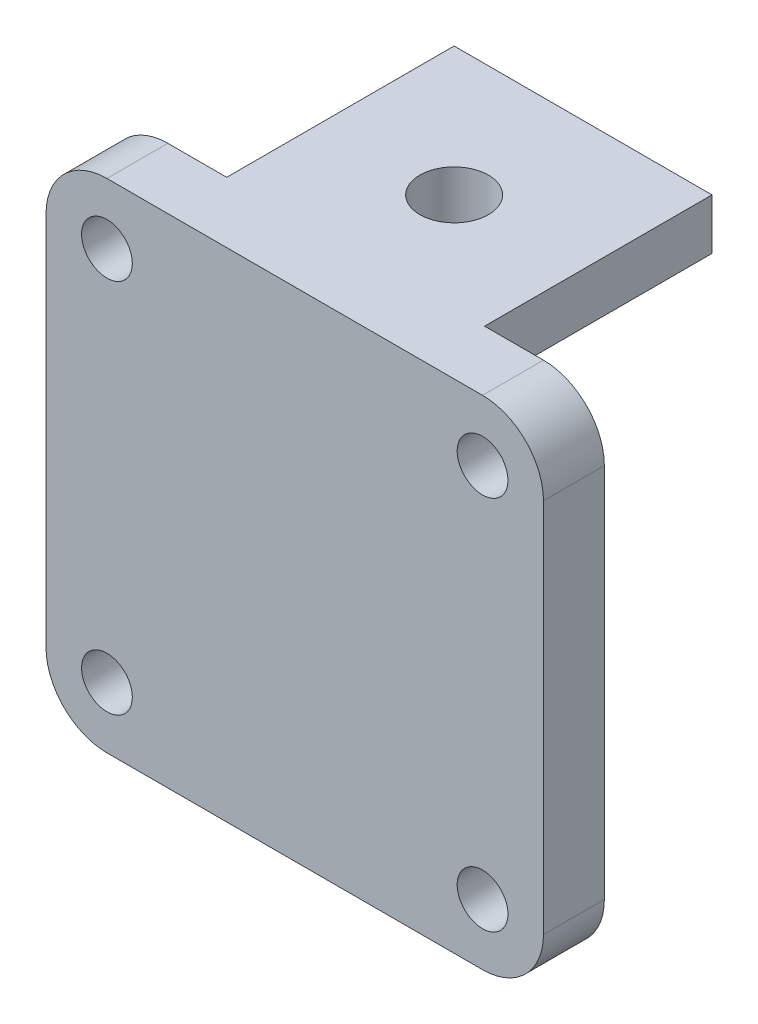
ISO-10303-21;
HEADER;
FILE_DESCRIPTION(('STEP AP214'),'2;1');
FILE_NAME('part.step','',(''),(''),'','','');
FILE_SCHEMA(('AUTOMOTIVE_DESIGN { 1 0 10303 214 1 1 1 1 }'));
ENDSEC;
DATA;
#1=APPLICATION_CONTEXT('core data for automotive mechanical design processes');
#2=APPLICATION_PROTOCOL_DEFINITION('international standard','automotive_design',2000,#1);
#3=PRODUCT_CONTEXT('',#1,'mechanical');
#4=PRODUCT('Part','Part','',(#3));
#5=PRODUCT_RELATED_PRODUCT_CATEGORY('part','',(#4));
#6=PRODUCT_DEFINITION_FORMATION('','',#4);
#7=PRODUCT_DEFINITION_CONTEXT('part definition',#1,'design');
#8=PRODUCT_DEFINITION('design','',#6,#7);
#9=PRODUCT_DEFINITION_SHAPE('','',#8);
#10=(LENGTH_UNIT() NAMED_UNIT(*) SI_UNIT(.MILLI.,.METRE.));
#11=(NAMED_UNIT(*) PLANE_ANGLE_UNIT() SI_UNIT($,.RADIAN.));
#12=(NAMED_UNIT(*) SI_UNIT($,.STERADIAN.) SOLID_ANGLE_UNIT());
#13=UNCERTAINTY_MEASURE_WITH_UNIT(LENGTH_MEASURE(1.E-05),#10,'distance_accuracy_value','');
#14=(GEOMETRIC_REPRESENTATION_CONTEXT(3) GLOBAL_UNCERTAINTY_ASSIGNED_CONTEXT((#13)) GLOBAL_UNIT_ASSIGNED_CONTEXT((#10,
#11,#12)) REPRESENTATION_CONTEXT('',''));
#15=CARTESIAN_POINT('',(0.,0.,0.));
#16=DIRECTION('',(0.,0.,1.));
#17=DIRECTION('',(1.,0.,0.));
#18=AXIS2_PLACEMENT_3D('',#15,#16,#17);
#19=CARTESIAN_POINT('',(12.7,5.,-12.7));
#20=DIRECTION('',(-1.,0.,0.));
#21=DIRECTION('',(0.,0.,1.));
#22=AXIS2_PLACEMENT_3D('',#19,#20,#21);
#23=PLANE('',#22);
#24=DIRECTION('',(0.,1.,0.));
#25=VECTOR('',#24,1.);
#26=CARTESIAN_POINT('',(12.7,5.,9.7));
#27=LINE('',#26,#25);
#28=CARTESIAN_POINT('',(12.7,0.,9.7));
#29=VERTEX_POINT('',#28);
#30=CARTESIAN_POINT('',(12.7,5.,9.7));
#31=VERTEX_POINT('',#30);
#32=EDGE_CURVE('E152',#29,#31,#27,.T.);
#33=ORIENTED_EDGE('',*,*,#32,.F.);
#34=DIRECTION('',(0.,0.,-1.));
#35=VECTOR('',#34,1.);
#36=CARTESIAN_POINT('',(12.7,0.,-12.7));
#37=LINE('',#36,#35);
#38=CARTESIAN_POINT('',(12.7,0.,-12.7));
#39=VERTEX_POINT('',#38);
#40=EDGE_CURVE('E137',#29,#39,#37,.T.);
#41=ORIENTED_EDGE('',*,*,#40,.T.);
#42=DIRECTION('',(0.,-1.,0.));
#43=VECTOR('',#42,1.);
#44=CARTESIAN_POINT('',(12.7,5.,-12.7));
#45=LINE('',#44,#43);
#46=CARTESIAN_POINT('',(12.7,5.,-12.7));
#47=VERTEX_POINT('',#46);
#48=EDGE_CURVE('E166',#47,#39,#45,.T.);
#49=ORIENTED_EDGE('',*,*,#48,.F.);
#50=DIRECTION('',(0.,0.,-1.));
#51=VECTOR('',#50,1.);
#52=CARTESIAN_POINT('',(12.7,5.,-12.7));
#53=LINE('',#52,#51);
#54=EDGE_CURVE('E153',#31,#47,#53,.T.);
#55=ORIENTED_EDGE('',*,*,#54,.F.);
#56=EDGE_LOOP('',(#33,#41,#49,#55));
#57=FACE_BOUND('',#56,.T.);
#58=ADVANCED_FACE('F47',(#57),#23,.F.);
#59=CARTESIAN_POINT('',(-12.7,5.,-12.7));
#60=DIRECTION('',(1.,0.,0.));
#61=DIRECTION('',(0.,0.,-1.));
#62=AXIS2_PLACEMENT_3D('',#59,#60,#61);
#63=PLANE('',#62);
#64=DIRECTION('',(0.,-1.,0.));
#65=VECTOR('',#64,1.);
#66=CARTESIAN_POINT('',(-12.7,5.,9.7));
#67=LINE('',#66,#65);
#68=CARTESIAN_POINT('',(-12.7,5.,9.7));
#69=VERTEX_POINT('',#68);
#70=CARTESIAN_POINT('',(-12.7,0.,9.7));
#71=VERTEX_POINT('',#70);
#72=EDGE_CURVE('E158',#69,#71,#67,.T.);
#73=ORIENTED_EDGE('',*,*,#72,.F.);
#74=DIRECTION('',(0.,0.,1.));
#75=VECTOR('',#74,1.);
#76=CARTESIAN_POINT('',(-12.7,5.,-12.7));
#77=LINE('',#76,#75);
#78=CARTESIAN_POINT('',(-12.7,5.,-12.7));
#79=VERTEX_POINT('',#78);
#80=EDGE_CURVE('E279',#79,#69,#77,.T.);
#81=ORIENTED_EDGE('',*,*,#80,.F.);
#82=DIRECTION('',(0.,-1.,0.));
#83=VECTOR('',#82,1.);
#84=CARTESIAN_POINT('',(-12.7,5.,-12.7));
#85=LINE('',#84,#83);
#86=CARTESIAN_POINT('',(-12.7,0.,-12.7));
#87=VERTEX_POINT('',#86);
#88=EDGE_CURVE('E172',#79,#87,#85,.T.);
#89=ORIENTED_EDGE('',*,*,#88,.T.);
#90=DIRECTION('',(0.,0.,1.));
#91=VECTOR('',#90,1.);
#92=CARTESIAN_POINT('',(-12.7,0.,-12.7));
#93=LINE('',#92,#91);
#94=EDGE_CURVE('E276',#87,#71,#93,.T.);
#95=ORIENTED_EDGE('',*,*,#94,.T.);
#96=EDGE_LOOP('',(#73,#81,#89,#95));
#97=FACE_BOUND('',#96,.T.);
#98=ADVANCED_FACE('F290',(#97),#63,.F.);
#99=CARTESIAN_POINT('',(0.,0.,0.));
#100=DIRECTION('',(0.,1.,0.));
#101=DIRECTION('',(0.,0.,1.));
#102=AXIS2_PLACEMENT_3D('',#99,#100,#101);
#103=PLANE('',#102);
#104=CARTESIAN_POINT('',(0.,0.,0.));
#105=DIRECTION('',(0.,1.,0.));
#106=DIRECTION('',(0.,0.,1.));
#107=AXIS2_PLACEMENT_3D('',#104,#105,#106);
#108=CIRCLE('',#107,3.37819999999999);
#109=CARTESIAN_POINT('',(0.,0.,3.37819999999999));
#110=VERTEX_POINT('',#109);
#111=EDGE_CURVE('E149',#110,#110,#108,.T.);
#112=ORIENTED_EDGE('',*,*,#111,.T.);
#113=EDGE_LOOP('',(#112));
#114=FACE_BOUND('',#113,.T.);
#115=DIRECTION('',(1.,0.,0.));
#116=VECTOR('',#115,1.);
#117=CARTESIAN_POINT('',(0.,0.,9.7));
#118=LINE('',#117,#116);
#119=EDGE_CURVE('E142',#71,#29,#118,.T.);
#120=ORIENTED_EDGE('',*,*,#119,.F.);
#121=ORIENTED_EDGE('',*,*,#94,.F.);
#122=DIRECTION('',(-1.,0.,0.));
#123=VECTOR('',#122,1.);
#124=CARTESIAN_POINT('',(-12.7,0.,-12.7));
#125=LINE('',#124,#123);
#126=EDGE_CURVE('E144',#39,#87,#125,.T.);
#127=ORIENTED_EDGE('',*,*,#126,.F.);
#128=ORIENTED_EDGE('',*,*,#40,.F.);
#129=EDGE_LOOP('',(#120,#121,#127,#128));
#130=FACE_BOUND('',#129,.T.);
#131=ADVANCED_FACE('F139',(#114,#130),#103,.F.);
#132=CARTESIAN_POINT('',(-12.7,5.,-12.7));
#133=DIRECTION('',(0.,0.,1.));
#134=DIRECTION('',(1.,0.,0.));
#135=AXIS2_PLACEMENT_3D('',#132,#133,#134);
#136=PLANE('',#135);
#137=ORIENTED_EDGE('',*,*,#126,.T.);
#138=ORIENTED_EDGE('',*,*,#88,.F.);
#139=DIRECTION('',(-1.,0.,0.));
#140=VECTOR('',#139,1.);
#141=CARTESIAN_POINT('',(-12.7,5.,-12.7));
#142=LINE('',#141,#140);
#143=EDGE_CURVE('E275',#47,#79,#142,.T.);
#144=ORIENTED_EDGE('',*,*,#143,.F.);
#145=ORIENTED_EDGE('',*,*,#48,.T.);
#146=EDGE_LOOP('',(#137,#138,#144,#145));
#147=FACE_BOUND('',#146,.T.);
#148=ADVANCED_FACE('F293',(#147),#136,.F.);
#149=CARTESIAN_POINT('',(0.,5.,0.));
#150=DIRECTION('',(0.,1.,0.));
#151=DIRECTION('',(0.,0.,1.));
#152=AXIS2_PLACEMENT_3D('',#149,#150,#151);
#153=PLANE('',#152);
#154=DIRECTION('',(1.,0.,0.));
#155=VECTOR('',#154,1.);
#156=CARTESIAN_POINT('',(0.,5.,15.7));
#157=LINE('',#156,#155);
#158=CARTESIAN_POINT('',(-18.5,5.,15.7));
#159=VERTEX_POINT('',#158);
#160=CARTESIAN_POINT('',(18.5,5.,15.7));
#161=VERTEX_POINT('',#160);
#162=EDGE_CURVE('E222',#159,#161,#157,.T.);
#163=ORIENTED_EDGE('',*,*,#162,.T.);
#164=DIRECTION('',(0.,0.,1.));
#165=VECTOR('',#164,1.);
#166=CARTESIAN_POINT('',(18.5,5.,0.));
#167=LINE('',#166,#165);
#168=CARTESIAN_POINT('',(18.5,5.,9.7));
#169=VERTEX_POINT('',#168);
#170=EDGE_CURVE('E11',#161,#169,#167,.F.);
#171=ORIENTED_EDGE('',*,*,#170,.T.);
#172=DIRECTION('',(1.,0.,0.));
#173=VECTOR('',#172,1.);
#174=CARTESIAN_POINT('',(0.,5.,9.7));
#175=LINE('',#174,#173);
#176=EDGE_CURVE('E264',#31,#169,#175,.T.);
#177=ORIENTED_EDGE('',*,*,#176,.F.);
#178=ORIENTED_EDGE('',*,*,#54,.T.);
#179=ORIENTED_EDGE('',*,*,#143,.T.);
#180=ORIENTED_EDGE('',*,*,#80,.T.);
#181=CARTESIAN_POINT('',(-18.5,5.,9.7));
#182=VERTEX_POINT('',#181);
#183=EDGE_CURVE('E225',#182,#69,#175,.T.);
#184=ORIENTED_EDGE('',*,*,#183,.F.);
#185=DIRECTION('',(0.,0.,1.));
#186=VECTOR('',#185,1.);
#187=CARTESIAN_POINT('',(-18.5,5.,15.7));
#188=LINE('',#187,#186);
#189=EDGE_CURVE('E56',#182,#159,#188,.T.);
#190=ORIENTED_EDGE('',*,*,#189,.T.);
#191=EDGE_LOOP('',(#163,#171,#177,#178,#179,#180,#184,#190));
#192=FACE_BOUND('',#191,.T.);
#193=CARTESIAN_POINT('',(0.,5.,0.));
#194=DIRECTION('',(0.,1.,0.));
#195=DIRECTION('',(0.,0.,1.));
#196=AXIS2_PLACEMENT_3D('',#193,#194,#195);
#197=CIRCLE('',#196,3.37819999999999);
#198=CARTESIAN_POINT('',(0.,5.,3.37819999999999));
#199=VERTEX_POINT('',#198);
#200=EDGE_CURVE('E157',#199,#199,#197,.T.);
#201=ORIENTED_EDGE('',*,*,#200,.F.);
#202=EDGE_LOOP('',(#201));
#203=FACE_BOUND('',#202,.T.);
#204=ADVANCED_FACE('F220',(#192,#203),#153,.T.);
#205=CARTESIAN_POINT('',(0.,5.,0.));
#206=DIRECTION('',(0.,1.,0.));
#207=DIRECTION('',(0.,0.,1.));
#208=AXIS2_PLACEMENT_3D('',#205,#206,#207);
#209=CYLINDRICAL_SURFACE('',#208,3.37819999999999);
#210=ORIENTED_EDGE('',*,*,#111,.F.);
#211=EDGE_LOOP('',(#210));
#212=FACE_BOUND('',#211,.T.);
#213=ORIENTED_EDGE('',*,*,#200,.T.);
#214=EDGE_LOOP('',(#213));
#215=FACE_BOUND('',#214,.T.);
#216=ADVANCED_FACE('F388',(#212,#215),#209,.F.);
#217=CARTESIAN_POINT('',(0.,0.,9.7));
#218=DIRECTION('',(0.,0.,1.));
#219=DIRECTION('',(1.,0.,0.));
#220=AXIS2_PLACEMENT_3D('',#217,#218,#219);
#221=PLANE('',#220);
#222=CARTESIAN_POINT('',(-18.5,-38.,9.7));
#223=DIRECTION('',(0.,0.,1.));
#224=DIRECTION('',(1.,0.,0.));
#225=AXIS2_PLACEMENT_3D('',#222,#223,#224);
#226=CIRCLE('',#225,2.5);
#227=CARTESIAN_POINT('',(-16.,-38.,9.7));
#228=VERTEX_POINT('',#227);
#229=EDGE_CURVE('E310',#228,#228,#226,.T.);
#230=ORIENTED_EDGE('',*,*,#229,.T.);
#231=EDGE_LOOP('',(#230));
#232=FACE_BOUND('',#231,.T.);
#233=CARTESIAN_POINT('',(18.5,-38.,9.7));
#234=DIRECTION('',(0.,0.,1.));
#235=DIRECTION('',(1.,0.,0.));
#236=AXIS2_PLACEMENT_3D('',#233,#234,#235);
#237=CIRCLE('',#236,2.5);
#238=CARTESIAN_POINT('',(21.,-38.,9.7));
#239=VERTEX_POINT('',#238);
#240=EDGE_CURVE('E314',#239,#239,#237,.T.);
#241=ORIENTED_EDGE('',*,*,#240,.T.);
#242=EDGE_LOOP('',(#241));
#243=FACE_BOUND('',#242,.T.);
#244=CARTESIAN_POINT('',(18.5,-1.,9.7));
#245=DIRECTION('',(0.,0.,1.));
#246=DIRECTION('',(1.,0.,0.));
#247=AXIS2_PLACEMENT_3D('',#244,#245,#246);
#248=CIRCLE('',#247,2.5);
#249=CARTESIAN_POINT('',(21.,-1.,9.7));
#250=VERTEX_POINT('',#249);
#251=EDGE_CURVE('E317',#250,#250,#248,.T.);
#252=ORIENTED_EDGE('',*,*,#251,.T.);
#253=EDGE_LOOP('',(#252));
#254=FACE_BOUND('',#253,.T.);
#255=CARTESIAN_POINT('',(-18.5,-1.,9.7));
#256=DIRECTION('',(0.,0.,1.));
#257=DIRECTION('',(1.,0.,0.));
#258=AXIS2_PLACEMENT_3D('',#255,#256,#257);
#259=CIRCLE('',#258,2.5);
#260=CARTESIAN_POINT('',(-16.,-1.,9.7));
#261=VERTEX_POINT('',#260);
#262=EDGE_CURVE('E240',#261,#261,#259,.T.);
#263=ORIENTED_EDGE('',*,*,#262,.T.);
#264=EDGE_LOOP('',(#263));
#265=FACE_BOUND('',#264,.T.);
#266=DIRECTION('',(0.,1.,0.));
#267=VECTOR('',#266,1.);
#268=CARTESIAN_POINT('',(24.5,0.,9.7));
#269=LINE('',#268,#267);
#270=CARTESIAN_POINT('',(24.5,-38.,9.7));
#271=VERTEX_POINT('',#270);
#272=CARTESIAN_POINT('',(24.5,-0.999999999999999,9.7));
#273=VERTEX_POINT('',#272);
#274=EDGE_CURVE('E306',#271,#273,#269,.T.);
#275=ORIENTED_EDGE('',*,*,#274,.F.);
#276=CARTESIAN_POINT('',(18.5,-38.,9.7));
#277=DIRECTION('',(0.,0.,1.));
#278=DIRECTION('',(1.,0.,0.));
#279=AXIS2_PLACEMENT_3D('',#276,#277,#278);
#280=CIRCLE('',#279,6.);
#281=CARTESIAN_POINT('',(18.5,-44.,9.7));
#282=VERTEX_POINT('',#281);
#283=EDGE_CURVE('E206',#271,#282,#280,.F.);
#284=ORIENTED_EDGE('',*,*,#283,.T.);
#285=DIRECTION('',(1.,0.,0.));
#286=VECTOR('',#285,1.);
#287=CARTESIAN_POINT('',(0.,-44.,9.7));
#288=LINE('',#287,#286);
#289=CARTESIAN_POINT('',(-18.5,-44.,9.7));
#290=VERTEX_POINT('',#289);
#291=EDGE_CURVE('E302',#290,#282,#288,.T.);
#292=ORIENTED_EDGE('',*,*,#291,.F.);
#293=CARTESIAN_POINT('',(-18.5,-38.,9.7));
#294=DIRECTION('',(0.,0.,1.));
#295=DIRECTION('',(1.,0.,0.));
#296=AXIS2_PLACEMENT_3D('',#293,#294,#295);
#297=CIRCLE('',#296,6.);
#298=CARTESIAN_POINT('',(-24.5,-38.,9.7));
#299=VERTEX_POINT('',#298);
#300=EDGE_CURVE('E203',#290,#299,#297,.F.);
#301=ORIENTED_EDGE('',*,*,#300,.T.);
#302=DIRECTION('',(0.,1.,0.));
#303=VECTOR('',#302,1.);
#304=CARTESIAN_POINT('',(-24.5,0.,9.7));
#305=LINE('',#304,#303);
#306=CARTESIAN_POINT('',(-24.5,-1.,9.7));
#307=VERTEX_POINT('',#306);
#308=EDGE_CURVE('E298',#299,#307,#305,.T.);
#309=ORIENTED_EDGE('',*,*,#308,.T.);
#310=CARTESIAN_POINT('',(-18.5,-1.,9.7));
#311=DIRECTION('',(0.,0.,1.));
#312=DIRECTION('',(1.,0.,0.));
#313=AXIS2_PLACEMENT_3D('',#310,#311,#312);
#314=CIRCLE('',#313,6.);
#315=EDGE_CURVE('E63',#307,#182,#314,.F.);
#316=ORIENTED_EDGE('',*,*,#315,.T.);
#317=ORIENTED_EDGE('',*,*,#183,.T.);
#318=ORIENTED_EDGE('',*,*,#72,.T.);
#319=ORIENTED_EDGE('',*,*,#119,.T.);
#320=ORIENTED_EDGE('',*,*,#32,.T.);
#321=ORIENTED_EDGE('',*,*,#176,.T.);
#322=CARTESIAN_POINT('',(18.5,-1.,9.7));
#323=DIRECTION('',(0.,0.,1.));
#324=DIRECTION('',(1.,0.,0.));
#325=AXIS2_PLACEMENT_3D('',#322,#323,#324);
#326=CIRCLE('',#325,6.);
#327=EDGE_CURVE('E200',#169,#273,#326,.F.);
#328=ORIENTED_EDGE('',*,*,#327,.T.);
#329=EDGE_LOOP('',(#275,#284,#292,#301,#309,#316,#317,#318,#319,#320,#321,#328));
#330=FACE_BOUND('',#329,.T.);
#331=ADVANCED_FACE('F162',(#232,#243,#254,#265,#330),#221,.F.);
#332=CARTESIAN_POINT('',(24.5,0.,9.7));
#333=DIRECTION('',(1.,0.,0.));
#334=DIRECTION('',(0.,1.,0.));
#335=AXIS2_PLACEMENT_3D('',#332,#333,#334);
#336=PLANE('',#335);
#337=DIRECTION('',(0.,1.,0.));
#338=VECTOR('',#337,1.);
#339=CARTESIAN_POINT('',(24.5,0.,15.7));
#340=LINE('',#339,#338);
#341=CARTESIAN_POINT('',(24.5,-38.,15.7));
#342=VERTEX_POINT('',#341);
#343=CARTESIAN_POINT('',(24.5,-0.999999999999999,15.7));
#344=VERTEX_POINT('',#343);
#345=EDGE_CURVE('E245',#342,#344,#340,.T.);
#346=ORIENTED_EDGE('',*,*,#345,.F.);
#347=DIRECTION('',(0.,0.,1.));
#348=VECTOR('',#347,1.);
#349=CARTESIAN_POINT('',(24.5,-38.,9.7));
#350=LINE('',#349,#348);
#351=EDGE_CURVE('E195',#342,#271,#350,.F.);
#352=ORIENTED_EDGE('',*,*,#351,.T.);
#353=ORIENTED_EDGE('',*,*,#274,.T.);
#354=DIRECTION('',(0.,0.,1.));
#355=VECTOR('',#354,1.);
#356=CARTESIAN_POINT('',(24.5,-0.999999999999999,9.7));
#357=LINE('',#356,#355);
#358=EDGE_CURVE('E191',#273,#344,#357,.T.);
#359=ORIENTED_EDGE('',*,*,#358,.T.);
#360=EDGE_LOOP('',(#346,#352,#353,#359));
#361=FACE_BOUND('',#360,.T.);
#362=ADVANCED_FACE('F366',(#361),#336,.T.);
#363=CARTESIAN_POINT('',(0.,-44.,9.7));
#364=DIRECTION('',(0.,-1.,0.));
#365=DIRECTION('',(0.,0.,-1.));
#366=AXIS2_PLACEMENT_3D('',#363,#364,#365);
#367=PLANE('',#366);
#368=ORIENTED_EDGE('',*,*,#291,.T.);
#369=DIRECTION('',(0.,0.,1.));
#370=VECTOR('',#369,1.);
#371=CARTESIAN_POINT('',(18.5,-44.,9.7));
#372=LINE('',#371,#370);
#373=CARTESIAN_POINT('',(18.5,-44.,15.7));
#374=VERTEX_POINT('',#373);
#375=EDGE_CURVE('E170',#282,#374,#372,.T.);
#376=ORIENTED_EDGE('',*,*,#375,.T.);
#377=DIRECTION('',(1.,0.,0.));
#378=VECTOR('',#377,1.);
#379=CARTESIAN_POINT('',(0.,-44.,15.7));
#380=LINE('',#379,#378);
#381=CARTESIAN_POINT('',(-18.5,-44.,15.7));
#382=VERTEX_POINT('',#381);
#383=EDGE_CURVE('E237',#382,#374,#380,.T.);
#384=ORIENTED_EDGE('',*,*,#383,.F.);
#385=DIRECTION('',(0.,0.,1.));
#386=VECTOR('',#385,1.);
#387=CARTESIAN_POINT('',(-18.5,-44.,9.7));
#388=LINE('',#387,#386);
#389=EDGE_CURVE('E165',#382,#290,#388,.F.);
#390=ORIENTED_EDGE('',*,*,#389,.T.);
#391=EDGE_LOOP('',(#368,#376,#384,#390));
#392=FACE_BOUND('',#391,.T.);
#393=ADVANCED_FACE('F372',(#392),#367,.T.);
#394=CARTESIAN_POINT('',(18.5,-1.,9.7));
#395=DIRECTION('',(0.,0.,1.));
#396=DIRECTION('',(1.,0.,0.));
#397=AXIS2_PLACEMENT_3D('',#394,#395,#396);
#398=CYLINDRICAL_SURFACE('',#397,2.5);
#399=ORIENTED_EDGE('',*,*,#251,.F.);
#400=EDGE_LOOP('',(#399));
#401=FACE_BOUND('',#400,.T.);
#402=CARTESIAN_POINT('',(18.5,-1.,15.7));
#403=DIRECTION('',(0.,0.,1.));
#404=DIRECTION('',(1.,0.,0.));
#405=AXIS2_PLACEMENT_3D('',#402,#403,#404);
#406=CIRCLE('',#405,2.5);
#407=CARTESIAN_POINT('',(21.,-1.,15.7));
#408=VERTEX_POINT('',#407);
#409=EDGE_CURVE('E256',#408,#408,#406,.T.);
#410=ORIENTED_EDGE('',*,*,#409,.T.);
#411=EDGE_LOOP('',(#410));
#412=FACE_BOUND('',#411,.T.);
#413=ADVANCED_FACE('F460',(#401,#412),#398,.F.);
#414=CARTESIAN_POINT('',(18.5,-38.,9.7));
#415=DIRECTION('',(0.,0.,1.));
#416=DIRECTION('',(1.,0.,0.));
#417=AXIS2_PLACEMENT_3D('',#414,#415,#416);
#418=CYLINDRICAL_SURFACE('',#417,2.5);
#419=ORIENTED_EDGE('',*,*,#240,.F.);
#420=EDGE_LOOP('',(#419));
#421=FACE_BOUND('',#420,.T.);
#422=CARTESIAN_POINT('',(18.5,-38.,15.7));
#423=DIRECTION('',(0.,0.,1.));
#424=DIRECTION('',(1.,0.,0.));
#425=AXIS2_PLACEMENT_3D('',#422,#423,#424);
#426=CIRCLE('',#425,2.5);
#427=CARTESIAN_POINT('',(21.,-38.,15.7));
#428=VERTEX_POINT('',#427);
#429=EDGE_CURVE('E252',#428,#428,#426,.T.);
#430=ORIENTED_EDGE('',*,*,#429,.T.);
#431=EDGE_LOOP('',(#430));
#432=FACE_BOUND('',#431,.T.);
#433=ADVANCED_FACE('F382',(#421,#432),#418,.F.);
#434=CARTESIAN_POINT('',(-18.5,-38.,9.7));
#435=DIRECTION('',(0.,0.,1.));
#436=DIRECTION('',(1.,0.,0.));
#437=AXIS2_PLACEMENT_3D('',#434,#435,#436);
#438=CYLINDRICAL_SURFACE('',#437,2.5);
#439=ORIENTED_EDGE('',*,*,#229,.F.);
#440=EDGE_LOOP('',(#439));
#441=FACE_BOUND('',#440,.T.);
#442=CARTESIAN_POINT('',(-18.5,-38.,15.7));
#443=DIRECTION('',(0.,0.,1.));
#444=DIRECTION('',(1.,0.,0.));
#445=AXIS2_PLACEMENT_3D('',#442,#443,#444);
#446=CIRCLE('',#445,2.5);
#447=CARTESIAN_POINT('',(-16.,-38.,15.7));
#448=VERTEX_POINT('',#447);
#449=EDGE_CURVE('E248',#448,#448,#446,.T.);
#450=ORIENTED_EDGE('',*,*,#449,.T.);
#451=EDGE_LOOP('',(#450));
#452=FACE_BOUND('',#451,.T.);
#453=ADVANCED_FACE('F376',(#441,#452),#438,.F.);
#454=CARTESIAN_POINT('',(-24.5,0.,9.7));
#455=DIRECTION('',(1.,0.,0.));
#456=DIRECTION('',(0.,0.,-1.));
#457=AXIS2_PLACEMENT_3D('',#454,#455,#456);
#458=PLANE('',#457);
#459=ORIENTED_EDGE('',*,*,#308,.F.);
#460=DIRECTION('',(0.,0.,1.));
#461=VECTOR('',#460,1.);
#462=CARTESIAN_POINT('',(-24.5,-38.,15.7));
#463=LINE('',#462,#461);
#464=CARTESIAN_POINT('',(-24.5,-38.,15.7));
#465=VERTEX_POINT('',#464);
#466=EDGE_CURVE('E211',#299,#465,#463,.T.);
#467=ORIENTED_EDGE('',*,*,#466,.T.);
#468=DIRECTION('',(0.,1.,0.));
#469=VECTOR('',#468,1.);
#470=CARTESIAN_POINT('',(-24.5,0.,15.7));
#471=LINE('',#470,#469);
#472=CARTESIAN_POINT('',(-24.5,-1.,15.7));
#473=VERTEX_POINT('',#472);
#474=EDGE_CURVE('E234',#465,#473,#471,.T.);
#475=ORIENTED_EDGE('',*,*,#474,.T.);
#476=DIRECTION('',(0.,0.,1.));
#477=VECTOR('',#476,1.);
#478=CARTESIAN_POINT('',(-24.5,-1.,9.7));
#479=LINE('',#478,#477);
#480=EDGE_CURVE('E71',#473,#307,#479,.F.);
#481=ORIENTED_EDGE('',*,*,#480,.T.);
#482=EDGE_LOOP('',(#459,#467,#475,#481));
#483=FACE_BOUND('',#482,.T.);
#484=ADVANCED_FACE('F330',(#483),#458,.F.);
#485=CARTESIAN_POINT('',(-18.5,-1.,9.7));
#486=DIRECTION('',(0.,0.,1.));
#487=DIRECTION('',(1.,0.,0.));
#488=AXIS2_PLACEMENT_3D('',#485,#486,#487);
#489=CYLINDRICAL_SURFACE('',#488,2.5);
#490=ORIENTED_EDGE('',*,*,#262,.F.);
#491=EDGE_LOOP('',(#490));
#492=FACE_BOUND('',#491,.T.);
#493=CARTESIAN_POINT('',(-18.5,-1.,15.7));
#494=DIRECTION('',(0.,0.,1.));
#495=DIRECTION('',(1.,0.,0.));
#496=AXIS2_PLACEMENT_3D('',#493,#494,#495);
#497=CIRCLE('',#496,2.5);
#498=CARTESIAN_POINT('',(-16.,-1.,15.7));
#499=VERTEX_POINT('',#498);
#500=EDGE_CURVE('E260',#499,#499,#497,.T.);
#501=ORIENTED_EDGE('',*,*,#500,.T.);
#502=EDGE_LOOP('',(#501));
#503=FACE_BOUND('',#502,.T.);
#504=ADVANCED_FACE('F327',(#492,#503),#489,.F.);
#505=CARTESIAN_POINT('',(0.,0.,15.7));
#506=DIRECTION('',(0.,0.,1.));
#507=DIRECTION('',(1.,0.,0.));
#508=AXIS2_PLACEMENT_3D('',#505,#506,#507);
#509=PLANE('',#508);
#510=ORIENTED_EDGE('',*,*,#383,.T.);
#511=CARTESIAN_POINT('',(18.5,-38.,15.7));
#512=DIRECTION('',(0.,0.,1.));
#513=DIRECTION('',(1.,0.,0.));
#514=AXIS2_PLACEMENT_3D('',#511,#512,#513);
#515=CIRCLE('',#514,6.);
#516=EDGE_CURVE('E188',#374,#342,#515,.T.);
#517=ORIENTED_EDGE('',*,*,#516,.T.);
#518=ORIENTED_EDGE('',*,*,#345,.T.);
#519=CARTESIAN_POINT('',(18.5,-1.,15.7));
#520=DIRECTION('',(0.,0.,1.));
#521=DIRECTION('',(1.,0.,0.));
#522=AXIS2_PLACEMENT_3D('',#519,#520,#521);
#523=CIRCLE('',#522,6.);
#524=EDGE_CURVE('E182',#344,#161,#523,.T.);
#525=ORIENTED_EDGE('',*,*,#524,.T.);
#526=ORIENTED_EDGE('',*,*,#162,.F.);
#527=CARTESIAN_POINT('',(-18.5,-1.,15.7));
#528=DIRECTION('',(0.,0.,1.));
#529=DIRECTION('',(1.,0.,0.));
#530=AXIS2_PLACEMENT_3D('',#527,#528,#529);
#531=CIRCLE('',#530,6.);
#532=EDGE_CURVE('E179',#159,#473,#531,.T.);
#533=ORIENTED_EDGE('',*,*,#532,.T.);
#534=ORIENTED_EDGE('',*,*,#474,.F.);
#535=CARTESIAN_POINT('',(-18.5,-38.,15.7));
#536=DIRECTION('',(0.,0.,1.));
#537=DIRECTION('',(1.,0.,0.));
#538=AXIS2_PLACEMENT_3D('',#535,#536,#537);
#539=CIRCLE('',#538,6.);
#540=EDGE_CURVE('E185',#465,#382,#539,.T.);
#541=ORIENTED_EDGE('',*,*,#540,.T.);
#542=EDGE_LOOP('',(#510,#517,#518,#525,#526,#533,#534,#541));
#543=FACE_BOUND('',#542,.T.);
#544=ORIENTED_EDGE('',*,*,#449,.F.);
#545=EDGE_LOOP('',(#544));
#546=FACE_BOUND('',#545,.T.);
#547=ORIENTED_EDGE('',*,*,#429,.F.);
#548=EDGE_LOOP('',(#547));
#549=FACE_BOUND('',#548,.T.);
#550=ORIENTED_EDGE('',*,*,#409,.F.);
#551=EDGE_LOOP('',(#550));
#552=FACE_BOUND('',#551,.T.);
#553=ORIENTED_EDGE('',*,*,#500,.F.);
#554=EDGE_LOOP('',(#553));
#555=FACE_BOUND('',#554,.T.);
#556=ADVANCED_FACE('F229',(#543,#546,#549,#552,#555),#509,.T.);
#557=CARTESIAN_POINT('',(18.5,-38.,9.7));
#558=DIRECTION('',(0.,0.,1.));
#559=DIRECTION('',(1.,0.,0.));
#560=AXIS2_PLACEMENT_3D('',#557,#558,#559);
#561=CYLINDRICAL_SURFACE('',#560,6.);
#562=ORIENTED_EDGE('',*,*,#283,.F.);
#563=ORIENTED_EDGE('',*,*,#351,.F.);
#564=ORIENTED_EDGE('',*,*,#516,.F.);
#565=ORIENTED_EDGE('',*,*,#375,.F.);
#566=EDGE_LOOP('',(#562,#563,#564,#565));
#567=FACE_BOUND('',#566,.T.);
#568=ADVANCED_FACE('F335',(#567),#561,.T.);
#569=CARTESIAN_POINT('',(-18.5,-38.,9.7));
#570=DIRECTION('',(0.,0.,-1.));
#571=DIRECTION('',(-1.,0.,0.));
#572=AXIS2_PLACEMENT_3D('',#569,#570,#571);
#573=CYLINDRICAL_SURFACE('',#572,6.);
#574=ORIENTED_EDGE('',*,*,#300,.F.);
#575=ORIENTED_EDGE('',*,*,#389,.F.);
#576=ORIENTED_EDGE('',*,*,#540,.F.);
#577=ORIENTED_EDGE('',*,*,#466,.F.);
#578=EDGE_LOOP('',(#574,#575,#576,#577));
#579=FACE_BOUND('',#578,.T.);
#580=ADVANCED_FACE('F341',(#579),#573,.T.);
#581=CARTESIAN_POINT('',(18.5,-1.,9.7));
#582=DIRECTION('',(0.,0.,1.));
#583=DIRECTION('',(1.,0.,0.));
#584=AXIS2_PLACEMENT_3D('',#581,#582,#583);
#585=CYLINDRICAL_SURFACE('',#584,6.);
#586=ORIENTED_EDGE('',*,*,#327,.F.);
#587=ORIENTED_EDGE('',*,*,#170,.F.);
#588=ORIENTED_EDGE('',*,*,#524,.F.);
#589=ORIENTED_EDGE('',*,*,#358,.F.);
#590=EDGE_LOOP('',(#586,#587,#588,#589));
#591=FACE_BOUND('',#590,.T.);
#592=ADVANCED_FACE('F355',(#591),#585,.T.);
#593=CARTESIAN_POINT('',(-18.5,-1.,0.));
#594=DIRECTION('',(0.,0.,-1.));
#595=DIRECTION('',(-1.,0.,0.));
#596=AXIS2_PLACEMENT_3D('',#593,#594,#595);
#597=CYLINDRICAL_SURFACE('',#596,6.);
#598=ORIENTED_EDGE('',*,*,#315,.F.);
#599=ORIENTED_EDGE('',*,*,#480,.F.);
#600=ORIENTED_EDGE('',*,*,#532,.F.);
#601=ORIENTED_EDGE('',*,*,#189,.F.);
#602=EDGE_LOOP('',(#598,#599,#600,#601));
#603=FACE_BOUND('',#602,.T.);
#604=ADVANCED_FACE('F49',(#603),#597,.T.);
#605=CLOSED_SHELL('',(#58,#98,#131,#148,#204,#216,#331,#362,#393,#413,#433,#453,#484,#504,#556,
#568,#580,#592,#604));
#606=MANIFOLD_SOLID_BREP('B2',#605);
#607=ADVANCED_BREP_SHAPE_REPRESENTATION('',(#18,#606),#14);
#608=SHAPE_DEFINITION_REPRESENTATION(#9,#607);
ENDSEC;
END-ISO-10303-21;
